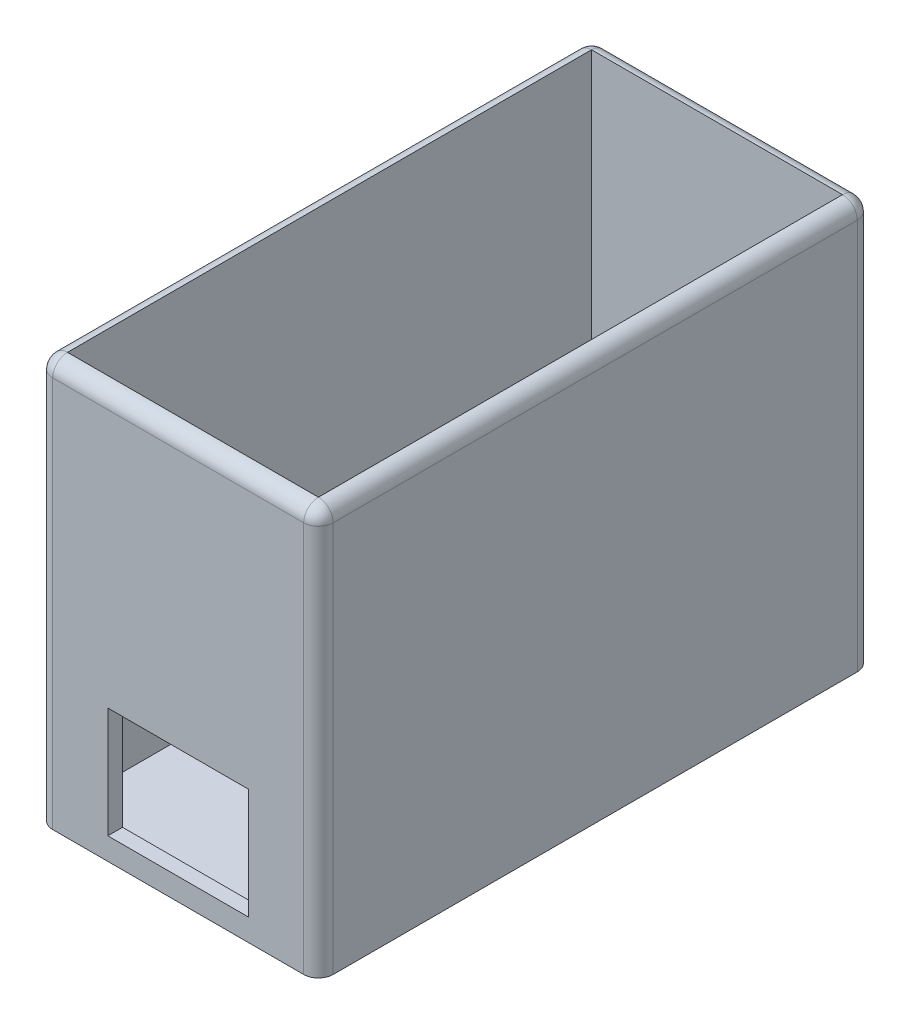
ISO-10303-21;
HEADER;
FILE_DESCRIPTION(('STEP AP214'),'2;1');
FILE_NAME('part.step','',(''),(''),'','','');
FILE_SCHEMA(('AUTOMOTIVE_DESIGN { 1 0 10303 214 1 1 1 1 }'));
ENDSEC;
DATA;
#1=APPLICATION_CONTEXT('core data for automotive mechanical design processes');
#2=APPLICATION_PROTOCOL_DEFINITION('international standard','automotive_design',2000,#1);
#3=PRODUCT_CONTEXT('',#1,'mechanical');
#4=PRODUCT('Part','Part','',(#3));
#5=PRODUCT_RELATED_PRODUCT_CATEGORY('part','',(#4));
#6=PRODUCT_DEFINITION_FORMATION('','',#4);
#7=PRODUCT_DEFINITION_CONTEXT('part definition',#1,'design');
#8=PRODUCT_DEFINITION('design','',#6,#7);
#9=PRODUCT_DEFINITION_SHAPE('','',#8);
#10=(LENGTH_UNIT() NAMED_UNIT(*) SI_UNIT(.MILLI.,.METRE.));
#11=(NAMED_UNIT(*) PLANE_ANGLE_UNIT() SI_UNIT($,.RADIAN.));
#12=(NAMED_UNIT(*) SI_UNIT($,.STERADIAN.) SOLID_ANGLE_UNIT());
#13=UNCERTAINTY_MEASURE_WITH_UNIT(LENGTH_MEASURE(1.E-05),#10,'distance_accuracy_value','');
#14=(GEOMETRIC_REPRESENTATION_CONTEXT(3) GLOBAL_UNCERTAINTY_ASSIGNED_CONTEXT((#13)) GLOBAL_UNIT_ASSIGNED_CONTEXT((#10,
#11,#12)) REPRESENTATION_CONTEXT('',''));
#15=CARTESIAN_POINT('',(0.,0.,0.));
#16=DIRECTION('',(0.,0.,1.));
#17=DIRECTION('',(1.,0.,0.));
#18=AXIS2_PLACEMENT_3D('',#15,#16,#17);
#19=CARTESIAN_POINT('',(0.,0.,75.));
#20=DIRECTION('',(1.,0.,0.));
#21=DIRECTION('',(0.,1.,0.));
#22=AXIS2_PLACEMENT_3D('',#19,#20,#21);
#23=PLANE('',#22);
#24=DIRECTION('',(0.,0.,-1.));
#25=VECTOR('',#24,1.);
#26=CARTESIAN_POINT('',(0.,53.,75.));
#27=LINE('',#26,#25);
#28=CARTESIAN_POINT('',(0.,53.,73.));
#29=VERTEX_POINT('',#28);
#30=CARTESIAN_POINT('',(0.,53.,2.));
#31=VERTEX_POINT('',#30);
#32=EDGE_CURVE('E252',#29,#31,#27,.T.);
#33=ORIENTED_EDGE('',*,*,#32,.T.);
#34=DIRECTION('',(0.,-1.,0.));
#35=VECTOR('',#34,1.);
#36=CARTESIAN_POINT('',(0.,0.,2.));
#37=LINE('',#36,#35);
#38=CARTESIAN_POINT('',(0.,0.,2.));
#39=VERTEX_POINT('',#38);
#40=EDGE_CURVE('E256',#31,#39,#37,.T.);
#41=ORIENTED_EDGE('',*,*,#40,.T.);
#42=DIRECTION('',(0.,0.,-1.));
#43=VECTOR('',#42,1.);
#44=CARTESIAN_POINT('',(0.,0.,75.));
#45=LINE('',#44,#43);
#46=CARTESIAN_POINT('',(0.,0.,73.));
#47=VERTEX_POINT('',#46);
#48=EDGE_CURVE('E245',#47,#39,#45,.T.);
#49=ORIENTED_EDGE('',*,*,#48,.F.);
#50=DIRECTION('',(0.,-1.,0.));
#51=VECTOR('',#50,1.);
#52=CARTESIAN_POINT('',(0.,0.,73.));
#53=LINE('',#52,#51);
#54=EDGE_CURVE('E249',#47,#29,#53,.F.);
#55=ORIENTED_EDGE('',*,*,#54,.T.);
#56=EDGE_LOOP('',(#33,#41,#49,#55));
#57=FACE_BOUND('',#56,.T.);
#58=ADVANCED_FACE('F39',(#57),#23,.F.);
#59=CARTESIAN_POINT('',(0.,0.,75.));
#60=DIRECTION('',(0.,1.,0.));
#61=DIRECTION('',(0.,0.,1.));
#62=AXIS2_PLACEMENT_3D('',#59,#60,#61);
#63=PLANE('',#62);
#64=ORIENTED_EDGE('',*,*,#48,.T.);
#65=CARTESIAN_POINT('',(2.,0.,2.));
#66=DIRECTION('',(0.,1.,0.));
#67=DIRECTION('',(0.,0.,1.));
#68=AXIS2_PLACEMENT_3D('',#65,#66,#67);
#69=CIRCLE('',#68,2.);
#70=CARTESIAN_POINT('',(2.,0.,0.));
#71=VERTEX_POINT('',#70);
#72=EDGE_CURVE('E295',#39,#71,#69,.F.);
#73=ORIENTED_EDGE('',*,*,#72,.T.);
#74=DIRECTION('',(1.,0.,0.));
#75=VECTOR('',#74,1.);
#76=CARTESIAN_POINT('',(0.,0.,0.));
#77=LINE('',#76,#75);
#78=CARTESIAN_POINT('',(36.,0.,0.));
#79=VERTEX_POINT('',#78);
#80=EDGE_CURVE('E198',#71,#79,#77,.T.);
#81=ORIENTED_EDGE('',*,*,#80,.T.);
#82=CARTESIAN_POINT('',(36.,0.,2.));
#83=DIRECTION('',(0.,1.,0.));
#84=DIRECTION('',(0.,0.,1.));
#85=AXIS2_PLACEMENT_3D('',#82,#83,#84);
#86=CIRCLE('',#85,2.);
#87=CARTESIAN_POINT('',(38.,0.,2.));
#88=VERTEX_POINT('',#87);
#89=EDGE_CURVE('E292',#79,#88,#86,.F.);
#90=ORIENTED_EDGE('',*,*,#89,.T.);
#91=DIRECTION('',(0.,0.,-1.));
#92=VECTOR('',#91,1.);
#93=CARTESIAN_POINT('',(38.,0.,75.));
#94=LINE('',#93,#92);
#95=CARTESIAN_POINT('',(38.,0.,73.));
#96=VERTEX_POINT('',#95);
#97=EDGE_CURVE('E238',#96,#88,#94,.T.);
#98=ORIENTED_EDGE('',*,*,#97,.F.);
#99=CARTESIAN_POINT('',(36.,0.,73.));
#100=DIRECTION('',(0.,1.,0.));
#101=DIRECTION('',(0.,0.,1.));
#102=AXIS2_PLACEMENT_3D('',#99,#100,#101);
#103=CIRCLE('',#102,2.);
#104=CARTESIAN_POINT('',(36.,0.,75.));
#105=VERTEX_POINT('',#104);
#106=EDGE_CURVE('E286',#96,#105,#103,.F.);
#107=ORIENTED_EDGE('',*,*,#106,.T.);
#108=DIRECTION('',(1.,0.,0.));
#109=VECTOR('',#108,1.);
#110=CARTESIAN_POINT('',(0.,0.,75.));
#111=LINE('',#110,#109);
#112=CARTESIAN_POINT('',(2.,0.,75.));
#113=VERTEX_POINT('',#112);
#114=EDGE_CURVE('E234',#113,#105,#111,.T.);
#115=ORIENTED_EDGE('',*,*,#114,.F.);
#116=CARTESIAN_POINT('',(2.,0.,73.));
#117=DIRECTION('',(0.,1.,0.));
#118=DIRECTION('',(0.,0.,1.));
#119=AXIS2_PLACEMENT_3D('',#116,#117,#118);
#120=CIRCLE('',#119,2.);
#121=EDGE_CURVE('E289',#113,#47,#120,.F.);
#122=ORIENTED_EDGE('',*,*,#121,.T.);
#123=EDGE_LOOP('',(#64,#73,#81,#90,#98,#107,#115,#122));
#124=FACE_BOUND('',#123,.T.);
#125=ADVANCED_FACE('F371',(#124),#63,.F.);
#126=CARTESIAN_POINT('',(38.,0.,75.));
#127=DIRECTION('',(-1.,0.,0.));
#128=DIRECTION('',(0.,-1.,0.));
#129=AXIS2_PLACEMENT_3D('',#126,#127,#128);
#130=PLANE('',#129);
#131=ORIENTED_EDGE('',*,*,#97,.T.);
#132=DIRECTION('',(0.,1.,0.));
#133=VECTOR('',#132,1.);
#134=CARTESIAN_POINT('',(38.,55.,2.));
#135=LINE('',#134,#133);
#136=CARTESIAN_POINT('',(38.,53.,2.));
#137=VERTEX_POINT('',#136);
#138=EDGE_CURVE('E283',#88,#137,#135,.T.);
#139=ORIENTED_EDGE('',*,*,#138,.T.);
#140=DIRECTION('',(0.,0.,-1.));
#141=VECTOR('',#140,1.);
#142=CARTESIAN_POINT('',(38.,53.,75.));
#143=LINE('',#142,#141);
#144=CARTESIAN_POINT('',(38.,53.,73.));
#145=VERTEX_POINT('',#144);
#146=EDGE_CURVE('E280',#137,#145,#143,.F.);
#147=ORIENTED_EDGE('',*,*,#146,.T.);
#148=DIRECTION('',(0.,1.,0.));
#149=VECTOR('',#148,1.);
#150=CARTESIAN_POINT('',(38.,0.,73.));
#151=LINE('',#150,#149);
#152=EDGE_CURVE('E277',#145,#96,#151,.F.);
#153=ORIENTED_EDGE('',*,*,#152,.T.);
#154=EDGE_LOOP('',(#131,#139,#147,#153));
#155=FACE_BOUND('',#154,.T.);
#156=ADVANCED_FACE('F377',(#155),#130,.F.);
#157=CARTESIAN_POINT('',(0.,0.,75.));
#158=DIRECTION('',(0.,0.,-1.));
#159=DIRECTION('',(-1.,0.,0.));
#160=AXIS2_PLACEMENT_3D('',#157,#158,#159);
#161=PLANE('',#160);
#162=DIRECTION('',(1.,0.,0.));
#163=VECTOR('',#162,1.);
#164=CARTESIAN_POINT('',(9.45672065119481,3.,75.));
#165=LINE('',#164,#163);
#166=CARTESIAN_POINT('',(9.45672065119481,3.,75.));
#167=VERTEX_POINT('',#166);
#168=CARTESIAN_POINT('',(28.5432793488052,3.,75.));
#169=VERTEX_POINT('',#168);
#170=EDGE_CURVE('E165',#167,#169,#165,.T.);
#171=ORIENTED_EDGE('',*,*,#170,.F.);
#172=DIRECTION('',(0.,-1.,0.));
#173=VECTOR('',#172,1.);
#174=CARTESIAN_POINT('',(9.45672065119481,3.,75.));
#175=LINE('',#174,#173);
#176=CARTESIAN_POINT('',(9.45672065119481,18.,75.));
#177=VERTEX_POINT('',#176);
#178=EDGE_CURVE('E55',#177,#167,#175,.T.);
#179=ORIENTED_EDGE('',*,*,#178,.F.);
#180=DIRECTION('',(-1.,0.,0.));
#181=VECTOR('',#180,1.);
#182=CARTESIAN_POINT('',(9.45672065119481,18.,75.));
#183=LINE('',#182,#181);
#184=CARTESIAN_POINT('',(28.5432793488052,18.,75.));
#185=VERTEX_POINT('',#184);
#186=EDGE_CURVE('E173',#185,#177,#183,.T.);
#187=ORIENTED_EDGE('',*,*,#186,.F.);
#188=DIRECTION('',(0.,1.,0.));
#189=VECTOR('',#188,1.);
#190=CARTESIAN_POINT('',(28.5432793488052,3.,75.));
#191=LINE('',#190,#189);
#192=EDGE_CURVE('E155',#169,#185,#191,.T.);
#193=ORIENTED_EDGE('',*,*,#192,.F.);
#194=EDGE_LOOP('',(#171,#179,#187,#193));
#195=FACE_BOUND('',#194,.T.);
#196=DIRECTION('',(-1.,0.,0.));
#197=VECTOR('',#196,1.);
#198=CARTESIAN_POINT('',(0.,53.,75.));
#199=LINE('',#198,#197);
#200=CARTESIAN_POINT('',(36.,53.,75.));
#201=VERTEX_POINT('',#200);
#202=CARTESIAN_POINT('',(1.99999999999999,53.,75.));
#203=VERTEX_POINT('',#202);
#204=EDGE_CURVE('E271',#201,#203,#199,.T.);
#205=ORIENTED_EDGE('',*,*,#204,.T.);
#206=DIRECTION('',(0.,-1.,0.));
#207=VECTOR('',#206,1.);
#208=CARTESIAN_POINT('',(2.,0.,75.));
#209=LINE('',#208,#207);
#210=EDGE_CURVE('E274',#203,#113,#209,.T.);
#211=ORIENTED_EDGE('',*,*,#210,.T.);
#212=ORIENTED_EDGE('',*,*,#114,.T.);
#213=DIRECTION('',(0.,1.,0.));
#214=VECTOR('',#213,1.);
#215=CARTESIAN_POINT('',(36.,0.,75.));
#216=LINE('',#215,#214);
#217=EDGE_CURVE('E268',#105,#201,#216,.T.);
#218=ORIENTED_EDGE('',*,*,#217,.T.);
#219=EDGE_LOOP('',(#205,#211,#212,#218));
#220=FACE_BOUND('',#219,.T.);
#221=ADVANCED_FACE('F170',(#195,#220),#161,.F.);
#222=CARTESIAN_POINT('',(0.,0.,0.));
#223=DIRECTION('',(0.,0.,-1.));
#224=DIRECTION('',(-1.,0.,0.));
#225=AXIS2_PLACEMENT_3D('',#222,#223,#224);
#226=PLANE('',#225);
#227=ORIENTED_EDGE('',*,*,#80,.F.);
#228=DIRECTION('',(0.,-1.,0.));
#229=VECTOR('',#228,1.);
#230=CARTESIAN_POINT('',(1.99999999999999,55.,0.));
#231=LINE('',#230,#229);
#232=CARTESIAN_POINT('',(1.99999999999999,53.,0.));
#233=VERTEX_POINT('',#232);
#234=EDGE_CURVE('E265',#71,#233,#231,.F.);
#235=ORIENTED_EDGE('',*,*,#234,.T.);
#236=DIRECTION('',(-1.,0.,0.));
#237=VECTOR('',#236,1.);
#238=CARTESIAN_POINT('',(38.,53.,0.));
#239=LINE('',#238,#237);
#240=CARTESIAN_POINT('',(36.,53.,0.));
#241=VERTEX_POINT('',#240);
#242=EDGE_CURVE('E262',#233,#241,#239,.F.);
#243=ORIENTED_EDGE('',*,*,#242,.T.);
#244=DIRECTION('',(0.,1.,0.));
#245=VECTOR('',#244,1.);
#246=CARTESIAN_POINT('',(36.,0.,0.));
#247=LINE('',#246,#245);
#248=EDGE_CURVE('E259',#241,#79,#247,.F.);
#249=ORIENTED_EDGE('',*,*,#248,.T.);
#250=EDGE_LOOP('',(#227,#235,#243,#249));
#251=FACE_BOUND('',#250,.T.);
#252=ADVANCED_FACE('F455',(#251),#226,.T.);
#253=CARTESIAN_POINT('',(2.,0.,75.));
#254=DIRECTION('',(1.,0.,0.));
#255=DIRECTION('',(0.,1.,0.));
#256=AXIS2_PLACEMENT_3D('',#253,#254,#255);
#257=PLANE('',#256);
#258=DIRECTION('',(0.,-1.,0.));
#259=VECTOR('',#258,1.);
#260=CARTESIAN_POINT('',(2.,0.,2.));
#261=LINE('',#260,#259);
#262=CARTESIAN_POINT('',(1.99999999999999,55.,2.));
#263=VERTEX_POINT('',#262);
#264=CARTESIAN_POINT('',(2.,2.,2.));
#265=VERTEX_POINT('',#264);
#266=EDGE_CURVE('E188',#263,#265,#261,.T.);
#267=ORIENTED_EDGE('',*,*,#266,.F.);
#268=DIRECTION('',(0.,0.,-1.));
#269=VECTOR('',#268,1.);
#270=CARTESIAN_POINT('',(1.99999999999999,55.,75.));
#271=LINE('',#270,#269);
#272=CARTESIAN_POINT('',(1.99999999999999,55.,73.));
#273=VERTEX_POINT('',#272);
#274=EDGE_CURVE('E222',#273,#263,#271,.T.);
#275=ORIENTED_EDGE('',*,*,#274,.F.);
#276=DIRECTION('',(0.,-1.,0.));
#277=VECTOR('',#276,1.);
#278=CARTESIAN_POINT('',(2.,0.,73.));
#279=LINE('',#278,#277);
#280=CARTESIAN_POINT('',(2.,2.,73.));
#281=VERTEX_POINT('',#280);
#282=EDGE_CURVE('E200',#273,#281,#279,.T.);
#283=ORIENTED_EDGE('',*,*,#282,.T.);
#284=DIRECTION('',(0.,0.,-1.));
#285=VECTOR('',#284,1.);
#286=CARTESIAN_POINT('',(2.,2.,75.));
#287=LINE('',#286,#285);
#288=EDGE_CURVE('E194',#281,#265,#287,.T.);
#289=ORIENTED_EDGE('',*,*,#288,.T.);
#290=EDGE_LOOP('',(#267,#275,#283,#289));
#291=FACE_BOUND('',#290,.T.);
#292=ADVANCED_FACE('F465',(#291),#257,.T.);
#293=CARTESIAN_POINT('',(0.,2.,75.));
#294=DIRECTION('',(0.,1.,0.));
#295=DIRECTION('',(0.,0.,1.));
#296=AXIS2_PLACEMENT_3D('',#293,#294,#295);
#297=PLANE('',#296);
#298=DIRECTION('',(1.,0.,0.));
#299=VECTOR('',#298,1.);
#300=CARTESIAN_POINT('',(0.,2.,2.));
#301=LINE('',#300,#299);
#302=CARTESIAN_POINT('',(36.,2.,2.));
#303=VERTEX_POINT('',#302);
#304=EDGE_CURVE('E192',#265,#303,#301,.T.);
#305=ORIENTED_EDGE('',*,*,#304,.F.);
#306=ORIENTED_EDGE('',*,*,#288,.F.);
#307=DIRECTION('',(1.,0.,0.));
#308=VECTOR('',#307,1.);
#309=CARTESIAN_POINT('',(0.,2.,73.));
#310=LINE('',#309,#308);
#311=CARTESIAN_POINT('',(36.,2.,73.));
#312=VERTEX_POINT('',#311);
#313=EDGE_CURVE('E204',#281,#312,#310,.T.);
#314=ORIENTED_EDGE('',*,*,#313,.T.);
#315=DIRECTION('',(0.,0.,-1.));
#316=VECTOR('',#315,1.);
#317=CARTESIAN_POINT('',(36.,2.,75.));
#318=LINE('',#317,#316);
#319=EDGE_CURVE('E199',#312,#303,#318,.T.);
#320=ORIENTED_EDGE('',*,*,#319,.T.);
#321=EDGE_LOOP('',(#305,#306,#314,#320));
#322=FACE_BOUND('',#321,.T.);
#323=ADVANCED_FACE('F469',(#322),#297,.T.);
#324=CARTESIAN_POINT('',(36.,0.,75.));
#325=DIRECTION('',(-1.,0.,0.));
#326=DIRECTION('',(0.,-1.,0.));
#327=AXIS2_PLACEMENT_3D('',#324,#325,#326);
#328=PLANE('',#327);
#329=DIRECTION('',(0.,1.,0.));
#330=VECTOR('',#329,1.);
#331=CARTESIAN_POINT('',(36.,0.,2.));
#332=LINE('',#331,#330);
#333=CARTESIAN_POINT('',(36.,55.,2.));
#334=VERTEX_POINT('',#333);
#335=EDGE_CURVE('E208',#303,#334,#332,.T.);
#336=ORIENTED_EDGE('',*,*,#335,.F.);
#337=ORIENTED_EDGE('',*,*,#319,.F.);
#338=DIRECTION('',(0.,1.,0.));
#339=VECTOR('',#338,1.);
#340=CARTESIAN_POINT('',(36.,0.,73.));
#341=LINE('',#340,#339);
#342=CARTESIAN_POINT('',(36.,55.,73.));
#343=VERTEX_POINT('',#342);
#344=EDGE_CURVE('E215',#312,#343,#341,.T.);
#345=ORIENTED_EDGE('',*,*,#344,.T.);
#346=DIRECTION('',(0.,0.,-1.));
#347=VECTOR('',#346,1.);
#348=CARTESIAN_POINT('',(36.,55.,75.));
#349=LINE('',#348,#347);
#350=EDGE_CURVE('E212',#343,#334,#349,.T.);
#351=ORIENTED_EDGE('',*,*,#350,.T.);
#352=EDGE_LOOP('',(#336,#337,#345,#351));
#353=FACE_BOUND('',#352,.T.);
#354=ADVANCED_FACE('F473',(#353),#328,.T.);
#355=CARTESIAN_POINT('',(0.,0.,73.));
#356=DIRECTION('',(0.,0.,-1.));
#357=DIRECTION('',(-1.,0.,0.));
#358=AXIS2_PLACEMENT_3D('',#355,#356,#357);
#359=PLANE('',#358);
#360=DIRECTION('',(0.,1.,0.));
#361=VECTOR('',#360,1.);
#362=CARTESIAN_POINT('',(9.45672065119481,0.,73.));
#363=LINE('',#362,#361);
#364=CARTESIAN_POINT('',(9.45672065119481,3.,73.));
#365=VERTEX_POINT('',#364);
#366=CARTESIAN_POINT('',(9.45672065119481,18.,73.));
#367=VERTEX_POINT('',#366);
#368=EDGE_CURVE('E11',#365,#367,#363,.T.);
#369=ORIENTED_EDGE('',*,*,#368,.F.);
#370=DIRECTION('',(-1.,0.,0.));
#371=VECTOR('',#370,1.);
#372=CARTESIAN_POINT('',(0.,3.,73.));
#373=LINE('',#372,#371);
#374=CARTESIAN_POINT('',(28.5432793488052,3.,73.));
#375=VERTEX_POINT('',#374);
#376=EDGE_CURVE('E298',#375,#365,#373,.T.);
#377=ORIENTED_EDGE('',*,*,#376,.F.);
#378=DIRECTION('',(0.,-1.,0.));
#379=VECTOR('',#378,1.);
#380=CARTESIAN_POINT('',(28.5432793488052,0.,73.));
#381=LINE('',#380,#379);
#382=CARTESIAN_POINT('',(28.5432793488052,18.,73.));
#383=VERTEX_POINT('',#382);
#384=EDGE_CURVE('E158',#383,#375,#381,.T.);
#385=ORIENTED_EDGE('',*,*,#384,.F.);
#386=DIRECTION('',(1.,0.,0.));
#387=VECTOR('',#386,1.);
#388=CARTESIAN_POINT('',(0.,18.,73.));
#389=LINE('',#388,#387);
#390=EDGE_CURVE('E48',#367,#383,#389,.T.);
#391=ORIENTED_EDGE('',*,*,#390,.F.);
#392=EDGE_LOOP('',(#369,#377,#385,#391));
#393=FACE_BOUND('',#392,.T.);
#394=ORIENTED_EDGE('',*,*,#282,.F.);
#395=DIRECTION('',(-1.,0.,0.));
#396=VECTOR('',#395,1.);
#397=CARTESIAN_POINT('',(0.,55.,73.));
#398=LINE('',#397,#396);
#399=EDGE_CURVE('E221',#343,#273,#398,.T.);
#400=ORIENTED_EDGE('',*,*,#399,.F.);
#401=ORIENTED_EDGE('',*,*,#344,.F.);
#402=ORIENTED_EDGE('',*,*,#313,.F.);
#403=EDGE_LOOP('',(#394,#400,#401,#402));
#404=FACE_BOUND('',#403,.T.);
#405=ADVANCED_FACE('F353',(#393,#404),#359,.T.);
#406=CARTESIAN_POINT('',(0.,0.,2.));
#407=DIRECTION('',(0.,0.,-1.));
#408=DIRECTION('',(-1.,0.,0.));
#409=AXIS2_PLACEMENT_3D('',#406,#407,#408);
#410=PLANE('',#409);
#411=ORIENTED_EDGE('',*,*,#266,.T.);
#412=ORIENTED_EDGE('',*,*,#304,.T.);
#413=ORIENTED_EDGE('',*,*,#335,.T.);
#414=DIRECTION('',(-1.,0.,0.));
#415=VECTOR('',#414,1.);
#416=CARTESIAN_POINT('',(0.,55.,2.));
#417=LINE('',#416,#415);
#418=EDGE_CURVE('E205',#334,#263,#417,.T.);
#419=ORIENTED_EDGE('',*,*,#418,.T.);
#420=EDGE_LOOP('',(#411,#412,#413,#419));
#421=FACE_BOUND('',#420,.T.);
#422=ADVANCED_FACE('F422',(#421),#410,.F.);
#423=CARTESIAN_POINT('',(36.,0.,73.));
#424=DIRECTION('',(0.,1.,0.));
#425=DIRECTION('',(-1.,0.,0.));
#426=AXIS2_PLACEMENT_3D('',#423,#424,#425);
#427=CYLINDRICAL_SURFACE('',#426,2.);
#428=ORIENTED_EDGE('',*,*,#106,.F.);
#429=ORIENTED_EDGE('',*,*,#152,.F.);
#430=CARTESIAN_POINT('',(36.,53.,73.));
#431=DIRECTION('',(0.,1.,0.));
#432=DIRECTION('',(0.,0.,1.));
#433=AXIS2_PLACEMENT_3D('',#430,#431,#432);
#434=CIRCLE('',#433,2.);
#435=EDGE_CURVE('E336',#201,#145,#434,.T.);
#436=ORIENTED_EDGE('',*,*,#435,.F.);
#437=ORIENTED_EDGE('',*,*,#217,.F.);
#438=EDGE_LOOP('',(#428,#429,#436,#437));
#439=FACE_BOUND('',#438,.T.);
#440=ADVANCED_FACE('F41',(#439),#427,.T.);
#441=CARTESIAN_POINT('',(36.,0.,2.));
#442=DIRECTION('',(0.,-1.,0.));
#443=DIRECTION('',(1.,0.,0.));
#444=AXIS2_PLACEMENT_3D('',#441,#442,#443);
#445=CYLINDRICAL_SURFACE('',#444,2.);
#446=ORIENTED_EDGE('',*,*,#89,.F.);
#447=ORIENTED_EDGE('',*,*,#248,.F.);
#448=CARTESIAN_POINT('',(36.,53.,2.));
#449=DIRECTION('',(0.,1.,0.));
#450=DIRECTION('',(0.,0.,1.));
#451=AXIS2_PLACEMENT_3D('',#448,#449,#450);
#452=CIRCLE('',#451,2.);
#453=EDGE_CURVE('E332',#137,#241,#452,.T.);
#454=ORIENTED_EDGE('',*,*,#453,.F.);
#455=ORIENTED_EDGE('',*,*,#138,.F.);
#456=EDGE_LOOP('',(#446,#447,#454,#455));
#457=FACE_BOUND('',#456,.T.);
#458=ADVANCED_FACE('F415',(#457),#445,.T.);
#459=CARTESIAN_POINT('',(36.,53.,75.));
#460=DIRECTION('',(0.,0.,-1.));
#461=DIRECTION('',(-1.,0.,0.));
#462=AXIS2_PLACEMENT_3D('',#459,#460,#461);
#463=CYLINDRICAL_SURFACE('',#462,2.);
#464=CARTESIAN_POINT('',(36.,53.,73.));
#465=DIRECTION('',(0.,0.,1.));
#466=DIRECTION('',(1.,0.,0.));
#467=AXIS2_PLACEMENT_3D('',#464,#465,#466);
#468=CIRCLE('',#467,2.);
#469=EDGE_CURVE('E193',#145,#343,#468,.T.);
#470=ORIENTED_EDGE('',*,*,#469,.F.);
#471=ORIENTED_EDGE('',*,*,#146,.F.);
#472=CARTESIAN_POINT('',(36.,53.,2.));
#473=DIRECTION('',(0.,0.,-1.));
#474=DIRECTION('',(-1.,0.,0.));
#475=AXIS2_PLACEMENT_3D('',#472,#473,#474);
#476=CIRCLE('',#475,2.);
#477=EDGE_CURVE('E328',#334,#137,#476,.T.);
#478=ORIENTED_EDGE('',*,*,#477,.F.);
#479=ORIENTED_EDGE('',*,*,#350,.F.);
#480=EDGE_LOOP('',(#470,#471,#478,#479));
#481=FACE_BOUND('',#480,.T.);
#482=ADVANCED_FACE('F412',(#481),#463,.T.);
#483=CARTESIAN_POINT('',(36.,53.,73.));
#484=DIRECTION('',(1.,0.,0.));
#485=DIRECTION('',(0.,0.,-1.));
#486=AXIS2_PLACEMENT_3D('',#483,#484,#485);
#487=SPHERICAL_SURFACE('',#486,2.);
#488=ORIENTED_EDGE('',*,*,#435,.T.);
#489=ORIENTED_EDGE('',*,*,#469,.T.);
#490=CARTESIAN_POINT('',(36.,53.,73.));
#491=DIRECTION('',(1.,0.,0.));
#492=DIRECTION('',(0.,0.,-1.));
#493=AXIS2_PLACEMENT_3D('',#490,#491,#492);
#494=CIRCLE('',#493,2.);
#495=EDGE_CURVE('E324',#201,#343,#494,.F.);
#496=ORIENTED_EDGE('',*,*,#495,.F.);
#497=EDGE_LOOP('',(#488,#489,#496));
#498=FACE_BOUND('',#497,.T.);
#499=ADVANCED_FACE('F408',(#498),#487,.T.);
#500=CARTESIAN_POINT('',(36.,53.,2.));
#501=DIRECTION('',(1.,0.,0.));
#502=DIRECTION('',(0.,0.,-1.));
#503=AXIS2_PLACEMENT_3D('',#500,#501,#502);
#504=SPHERICAL_SURFACE('',#503,2.);
#505=ORIENTED_EDGE('',*,*,#477,.T.);
#506=ORIENTED_EDGE('',*,*,#453,.T.);
#507=CARTESIAN_POINT('',(36.,53.,2.));
#508=DIRECTION('',(1.,0.,0.));
#509=DIRECTION('',(0.,0.,-1.));
#510=AXIS2_PLACEMENT_3D('',#507,#508,#509);
#511=CIRCLE('',#510,2.);
#512=EDGE_CURVE('E320',#334,#241,#511,.F.);
#513=ORIENTED_EDGE('',*,*,#512,.F.);
#514=EDGE_LOOP('',(#505,#506,#513));
#515=FACE_BOUND('',#514,.T.);
#516=ADVANCED_FACE('F404',(#515),#504,.T.);
#517=CARTESIAN_POINT('',(0.,53.,73.));
#518=DIRECTION('',(-1.,0.,0.));
#519=DIRECTION('',(0.,0.,1.));
#520=AXIS2_PLACEMENT_3D('',#517,#518,#519);
#521=CYLINDRICAL_SURFACE('',#520,2.);
#522=ORIENTED_EDGE('',*,*,#495,.T.);
#523=ORIENTED_EDGE('',*,*,#399,.T.);
#524=CARTESIAN_POINT('',(1.99999999999999,53.,73.));
#525=DIRECTION('',(-1.,0.,0.));
#526=DIRECTION('',(0.,0.,1.));
#527=AXIS2_PLACEMENT_3D('',#524,#525,#526);
#528=CIRCLE('',#527,2.);
#529=EDGE_CURVE('E316',#203,#273,#528,.T.);
#530=ORIENTED_EDGE('',*,*,#529,.F.);
#531=ORIENTED_EDGE('',*,*,#204,.F.);
#532=EDGE_LOOP('',(#522,#523,#530,#531));
#533=FACE_BOUND('',#532,.T.);
#534=ADVANCED_FACE('F400',(#533),#521,.T.);
#535=CARTESIAN_POINT('',(2.,0.,73.));
#536=DIRECTION('',(0.,-1.,0.));
#537=DIRECTION('',(1.,0.,0.));
#538=AXIS2_PLACEMENT_3D('',#535,#536,#537);
#539=CYLINDRICAL_SURFACE('',#538,2.);
#540=ORIENTED_EDGE('',*,*,#121,.F.);
#541=ORIENTED_EDGE('',*,*,#210,.F.);
#542=CARTESIAN_POINT('',(1.99999999999999,53.,73.));
#543=DIRECTION('',(0.,1.,0.));
#544=DIRECTION('',(0.,0.,1.));
#545=AXIS2_PLACEMENT_3D('',#542,#543,#544);
#546=CIRCLE('',#545,2.);
#547=EDGE_CURVE('E312',#29,#203,#546,.T.);
#548=ORIENTED_EDGE('',*,*,#547,.F.);
#549=ORIENTED_EDGE('',*,*,#54,.F.);
#550=EDGE_LOOP('',(#540,#541,#548,#549));
#551=FACE_BOUND('',#550,.T.);
#552=ADVANCED_FACE('F396',(#551),#539,.T.);
#553=CARTESIAN_POINT('',(2.,0.,2.));
#554=DIRECTION('',(0.,1.,0.));
#555=DIRECTION('',(-1.,0.,0.));
#556=AXIS2_PLACEMENT_3D('',#553,#554,#555);
#557=CYLINDRICAL_SURFACE('',#556,2.);
#558=ORIENTED_EDGE('',*,*,#72,.F.);
#559=ORIENTED_EDGE('',*,*,#40,.F.);
#560=CARTESIAN_POINT('',(1.99999999999999,53.,2.));
#561=DIRECTION('',(0.,1.,0.));
#562=DIRECTION('',(0.,0.,1.));
#563=AXIS2_PLACEMENT_3D('',#560,#561,#562);
#564=CIRCLE('',#563,2.);
#565=EDGE_CURVE('E308',#233,#31,#564,.T.);
#566=ORIENTED_EDGE('',*,*,#565,.F.);
#567=ORIENTED_EDGE('',*,*,#234,.F.);
#568=EDGE_LOOP('',(#558,#559,#566,#567));
#569=FACE_BOUND('',#568,.T.);
#570=ADVANCED_FACE('F392',(#569),#557,.T.);
#571=CARTESIAN_POINT('',(0.,53.,2.));
#572=DIRECTION('',(1.,0.,0.));
#573=DIRECTION('',(0.,0.,-1.));
#574=AXIS2_PLACEMENT_3D('',#571,#572,#573);
#575=CYLINDRICAL_SURFACE('',#574,2.);
#576=ORIENTED_EDGE('',*,*,#512,.T.);
#577=ORIENTED_EDGE('',*,*,#242,.F.);
#578=CARTESIAN_POINT('',(1.99999999999999,53.,2.));
#579=DIRECTION('',(-1.,0.,0.));
#580=DIRECTION('',(0.,0.,1.));
#581=AXIS2_PLACEMENT_3D('',#578,#579,#580);
#582=CIRCLE('',#581,2.);
#583=EDGE_CURVE('E304',#263,#233,#582,.T.);
#584=ORIENTED_EDGE('',*,*,#583,.F.);
#585=ORIENTED_EDGE('',*,*,#418,.F.);
#586=EDGE_LOOP('',(#576,#577,#584,#585));
#587=FACE_BOUND('',#586,.T.);
#588=ADVANCED_FACE('F388',(#587),#575,.T.);
#589=CARTESIAN_POINT('',(1.99999999999999,53.,73.));
#590=DIRECTION('',(0.,0.,1.));
#591=DIRECTION('',(1.,0.,0.));
#592=AXIS2_PLACEMENT_3D('',#589,#590,#591);
#593=SPHERICAL_SURFACE('',#592,2.);
#594=ORIENTED_EDGE('',*,*,#547,.T.);
#595=ORIENTED_EDGE('',*,*,#529,.T.);
#596=CARTESIAN_POINT('',(1.99999999999999,53.,73.));
#597=DIRECTION('',(0.,0.,1.));
#598=DIRECTION('',(1.,0.,0.));
#599=AXIS2_PLACEMENT_3D('',#596,#597,#598);
#600=CIRCLE('',#599,2.);
#601=EDGE_CURVE('E301',#29,#273,#600,.F.);
#602=ORIENTED_EDGE('',*,*,#601,.F.);
#603=EDGE_LOOP('',(#594,#595,#602));
#604=FACE_BOUND('',#603,.T.);
#605=ADVANCED_FACE('F384',(#604),#593,.T.);
#606=CARTESIAN_POINT('',(1.99999999999999,53.,2.));
#607=DIRECTION('',(0.,0.,-1.));
#608=DIRECTION('',(-1.,0.,0.));
#609=AXIS2_PLACEMENT_3D('',#606,#607,#608);
#610=SPHERICAL_SURFACE('',#609,2.);
#611=ORIENTED_EDGE('',*,*,#583,.T.);
#612=ORIENTED_EDGE('',*,*,#565,.T.);
#613=CARTESIAN_POINT('',(1.99999999999999,53.,2.));
#614=DIRECTION('',(0.,0.,-1.));
#615=DIRECTION('',(-1.,0.,0.));
#616=AXIS2_PLACEMENT_3D('',#613,#614,#615);
#617=CIRCLE('',#616,2.);
#618=EDGE_CURVE('E183',#263,#31,#617,.F.);
#619=ORIENTED_EDGE('',*,*,#618,.F.);
#620=EDGE_LOOP('',(#611,#612,#619));
#621=FACE_BOUND('',#620,.T.);
#622=ADVANCED_FACE('F365',(#621),#610,.T.);
#623=CARTESIAN_POINT('',(1.99999999999999,53.,75.));
#624=DIRECTION('',(0.,0.,-1.));
#625=DIRECTION('',(-1.,0.,0.));
#626=AXIS2_PLACEMENT_3D('',#623,#624,#625);
#627=CYLINDRICAL_SURFACE('',#626,2.);
#628=ORIENTED_EDGE('',*,*,#601,.T.);
#629=ORIENTED_EDGE('',*,*,#274,.T.);
#630=ORIENTED_EDGE('',*,*,#618,.T.);
#631=ORIENTED_EDGE('',*,*,#32,.F.);
#632=EDGE_LOOP('',(#628,#629,#630,#631));
#633=FACE_BOUND('',#632,.T.);
#634=ADVANCED_FACE('F358',(#633),#627,.T.);
#635=CARTESIAN_POINT('',(9.45672065119481,3.,70.));
#636=DIRECTION('',(-1.,0.,0.));
#637=DIRECTION('',(0.,0.,1.));
#638=AXIS2_PLACEMENT_3D('',#635,#636,#637);
#639=PLANE('',#638);
#640=ORIENTED_EDGE('',*,*,#368,.T.);
#641=DIRECTION('',(0.,0.,1.));
#642=VECTOR('',#641,1.);
#643=CARTESIAN_POINT('',(9.45672065119481,18.,70.));
#644=LINE('',#643,#642);
#645=EDGE_CURVE('E180',#367,#177,#644,.T.);
#646=ORIENTED_EDGE('',*,*,#645,.T.);
#647=ORIENTED_EDGE('',*,*,#178,.T.);
#648=DIRECTION('',(0.,0.,1.));
#649=VECTOR('',#648,1.);
#650=CARTESIAN_POINT('',(9.45672065119481,3.,70.));
#651=LINE('',#650,#649);
#652=EDGE_CURVE('E162',#365,#167,#651,.T.);
#653=ORIENTED_EDGE('',*,*,#652,.F.);
#654=EDGE_LOOP('',(#640,#646,#647,#653));
#655=FACE_BOUND('',#654,.T.);
#656=ADVANCED_FACE('F355',(#655),#639,.F.);
#657=CARTESIAN_POINT('',(9.45672065119481,18.,70.));
#658=DIRECTION('',(0.,1.,0.));
#659=DIRECTION('',(0.,0.,1.));
#660=AXIS2_PLACEMENT_3D('',#657,#658,#659);
#661=PLANE('',#660);
#662=ORIENTED_EDGE('',*,*,#390,.T.);
#663=DIRECTION('',(0.,0.,1.));
#664=VECTOR('',#663,1.);
#665=CARTESIAN_POINT('',(28.5432793488052,18.,70.));
#666=LINE('',#665,#664);
#667=EDGE_CURVE('E161',#383,#185,#666,.T.);
#668=ORIENTED_EDGE('',*,*,#667,.T.);
#669=ORIENTED_EDGE('',*,*,#186,.T.);
#670=ORIENTED_EDGE('',*,*,#645,.F.);
#671=EDGE_LOOP('',(#662,#668,#669,#670));
#672=FACE_BOUND('',#671,.T.);
#673=ADVANCED_FACE('F350',(#672),#661,.F.);
#674=CARTESIAN_POINT('',(28.5432793488052,3.,70.));
#675=DIRECTION('',(1.,0.,0.));
#676=DIRECTION('',(0.,0.,-1.));
#677=AXIS2_PLACEMENT_3D('',#674,#675,#676);
#678=PLANE('',#677);
#679=ORIENTED_EDGE('',*,*,#384,.T.);
#680=DIRECTION('',(0.,0.,1.));
#681=VECTOR('',#680,1.);
#682=CARTESIAN_POINT('',(28.5432793488052,3.,70.));
#683=LINE('',#682,#681);
#684=EDGE_CURVE('E63',#375,#169,#683,.T.);
#685=ORIENTED_EDGE('',*,*,#684,.T.);
#686=ORIENTED_EDGE('',*,*,#192,.T.);
#687=ORIENTED_EDGE('',*,*,#667,.F.);
#688=EDGE_LOOP('',(#679,#685,#686,#687));
#689=FACE_BOUND('',#688,.T.);
#690=ADVANCED_FACE('F152',(#689),#678,.F.);
#691=CARTESIAN_POINT('',(9.45672065119481,3.,70.));
#692=DIRECTION('',(0.,-1.,0.));
#693=DIRECTION('',(0.,0.,-1.));
#694=AXIS2_PLACEMENT_3D('',#691,#692,#693);
#695=PLANE('',#694);
#696=ORIENTED_EDGE('',*,*,#376,.T.);
#697=ORIENTED_EDGE('',*,*,#652,.T.);
#698=ORIENTED_EDGE('',*,*,#170,.T.);
#699=ORIENTED_EDGE('',*,*,#684,.F.);
#700=EDGE_LOOP('',(#696,#697,#698,#699));
#701=FACE_BOUND('',#700,.T.);
#702=ADVANCED_FACE('F166',(#701),#695,.F.);
#703=CLOSED_SHELL('',(#58,#125,#156,#221,#252,#292,#323,#354,#405,#422,#440,#458,#482,#499,#516,
#534,#552,#570,#588,#605,#622,#634,#656,#673,#690,#702));
#704=MANIFOLD_SOLID_BREP('B2',#703);
#705=ADVANCED_BREP_SHAPE_REPRESENTATION('',(#18,#704),#14);
#706=SHAPE_DEFINITION_REPRESENTATION(#9,#705);
ENDSEC;
END-ISO-10303-21;
